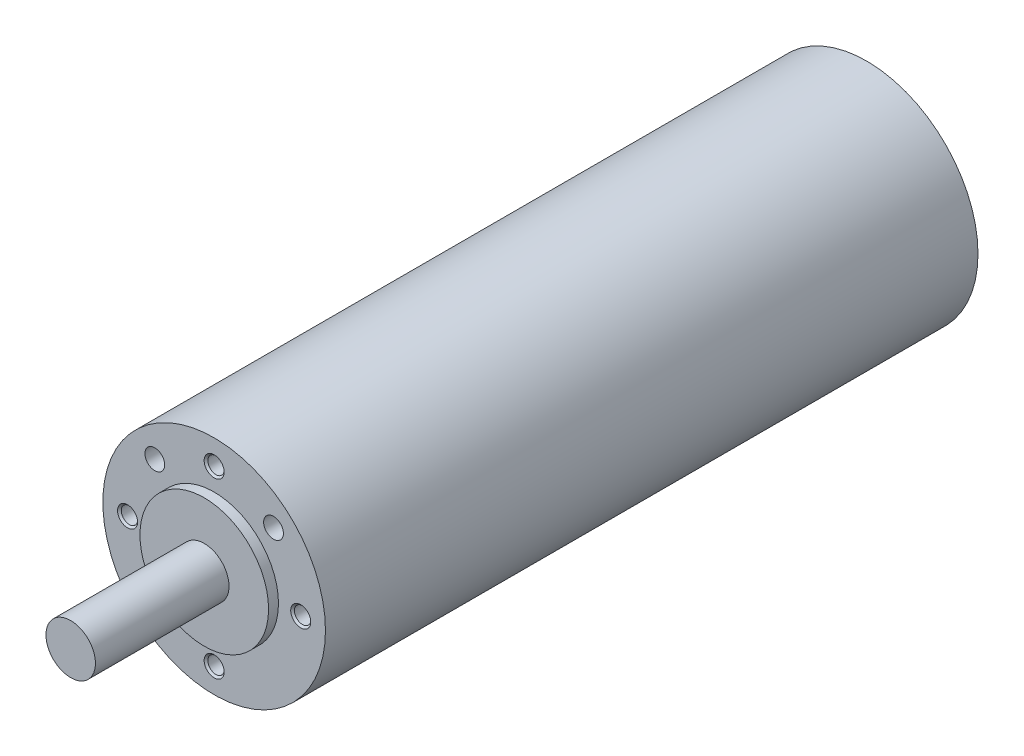
ISO-10303-21;
HEADER;
FILE_DESCRIPTION(('STEP AP214'),'2;1');
FILE_NAME('part.step','',(''),(''),'','','');
FILE_SCHEMA(('AUTOMOTIVE_DESIGN { 1 0 10303 214 1 1 1 1 }'));
ENDSEC;
DATA;
#1=APPLICATION_CONTEXT('core data for automotive mechanical design processes');
#2=APPLICATION_PROTOCOL_DEFINITION('international standard','automotive_design',2000,#1);
#3=PRODUCT_CONTEXT('',#1,'mechanical');
#4=PRODUCT('Part','Part','',(#3));
#5=PRODUCT_RELATED_PRODUCT_CATEGORY('part','',(#4));
#6=PRODUCT_DEFINITION_FORMATION('','',#4);
#7=PRODUCT_DEFINITION_CONTEXT('part definition',#1,'design');
#8=PRODUCT_DEFINITION('design','',#6,#7);
#9=PRODUCT_DEFINITION_SHAPE('','',#8);
#10=(LENGTH_UNIT() NAMED_UNIT(*) SI_UNIT(.MILLI.,.METRE.));
#11=(NAMED_UNIT(*) PLANE_ANGLE_UNIT() SI_UNIT($,.RADIAN.));
#12=(NAMED_UNIT(*) SI_UNIT($,.STERADIAN.) SOLID_ANGLE_UNIT());
#13=UNCERTAINTY_MEASURE_WITH_UNIT(LENGTH_MEASURE(1.E-05),#10,'distance_accuracy_value','');
#14=(GEOMETRIC_REPRESENTATION_CONTEXT(3) GLOBAL_UNCERTAINTY_ASSIGNED_CONTEXT((#13)) GLOBAL_UNIT_ASSIGNED_CONTEXT((#10,
#11,#12)) REPRESENTATION_CONTEXT('',''));
#15=CARTESIAN_POINT('',(0.,0.,0.));
#16=DIRECTION('',(0.,0.,1.));
#17=DIRECTION('',(1.,0.,0.));
#18=AXIS2_PLACEMENT_3D('',#15,#16,#17);
#19=CARTESIAN_POINT('',(0.,0.,-131.9));
#20=DIRECTION('',(0.,0.,1.));
#21=DIRECTION('',(1.,0.,0.));
#22=AXIS2_PLACEMENT_3D('',#19,#20,#21);
#23=CYLINDRICAL_SURFACE('',#22,22.5);
#24=CARTESIAN_POINT('',(0.,0.,-131.9));
#25=DIRECTION('',(0.,0.,1.));
#26=DIRECTION('',(1.,0.,0.));
#27=AXIS2_PLACEMENT_3D('',#24,#25,#26);
#28=CIRCLE('',#27,22.5);
#29=CARTESIAN_POINT('',(22.5,0.,-131.9));
#30=VERTEX_POINT('',#29);
#31=EDGE_CURVE('E126',#30,#30,#28,.T.);
#32=ORIENTED_EDGE('',*,*,#31,.T.);
#33=EDGE_LOOP('',(#32));
#34=FACE_BOUND('',#33,.T.);
#35=CARTESIAN_POINT('',(0.,0.,0.));
#36=DIRECTION('',(0.,0.,1.));
#37=DIRECTION('',(1.,0.,0.));
#38=AXIS2_PLACEMENT_3D('',#35,#36,#37);
#39=CIRCLE('',#38,22.5);
#40=CARTESIAN_POINT('',(22.5,0.,0.));
#41=VERTEX_POINT('',#40);
#42=EDGE_CURVE('E56',#41,#41,#39,.T.);
#43=ORIENTED_EDGE('',*,*,#42,.F.);
#44=EDGE_LOOP('',(#43));
#45=FACE_BOUND('',#44,.T.);
#46=ADVANCED_FACE('F53',(#34,#45),#23,.T.);
#47=CARTESIAN_POINT('',(0.,0.,-131.9));
#48=DIRECTION('',(0.,0.,1.));
#49=DIRECTION('',(1.,0.,0.));
#50=AXIS2_PLACEMENT_3D('',#47,#48,#49);
#51=PLANE('',#50);
#52=ORIENTED_EDGE('',*,*,#31,.F.);
#53=EDGE_LOOP('',(#52));
#54=FACE_BOUND('',#53,.T.);
#55=ADVANCED_FACE('F136',(#54),#51,.F.);
#56=CARTESIAN_POINT('',(0.,0.,0.));
#57=DIRECTION('',(0.,0.,1.));
#58=DIRECTION('',(1.,0.,0.));
#59=AXIS2_PLACEMENT_3D('',#56,#57,#58);
#60=PLANE('',#59);
#61=CARTESIAN_POINT('',(-12.,12.737739202857,0.));
#62=DIRECTION('',(0.,0.,1.));
#63=DIRECTION('',(1.,0.,0.));
#64=AXIS2_PLACEMENT_3D('',#61,#62,#63);
#65=CIRCLE('',#64,2.);
#66=CARTESIAN_POINT('',(-10.,12.737739202857,0.));
#67=VERTEX_POINT('',#66);
#68=EDGE_CURVE('E222',#67,#67,#65,.T.);
#69=ORIENTED_EDGE('',*,*,#68,.F.);
#70=EDGE_LOOP('',(#69));
#71=FACE_BOUND('',#70,.T.);
#72=CARTESIAN_POINT('',(12.,12.737739202857,0.));
#73=DIRECTION('',(0.,0.,1.));
#74=DIRECTION('',(1.,0.,0.));
#75=AXIS2_PLACEMENT_3D('',#72,#73,#74);
#76=CIRCLE('',#75,2.);
#77=CARTESIAN_POINT('',(14.,12.737739202857,0.));
#78=VERTEX_POINT('',#77);
#79=EDGE_CURVE('E226',#78,#78,#76,.T.);
#80=ORIENTED_EDGE('',*,*,#79,.F.);
#81=EDGE_LOOP('',(#80));
#82=FACE_BOUND('',#81,.T.);
#83=CARTESIAN_POINT('',(0.,17.5,0.));
#84=DIRECTION('',(0.,0.,1.));
#85=DIRECTION('',(1.,0.,0.));
#86=AXIS2_PLACEMENT_3D('',#83,#84,#85);
#87=CIRCLE('',#86,2.025);
#88=CARTESIAN_POINT('',(2.025,17.5,0.));
#89=VERTEX_POINT('',#88);
#90=EDGE_CURVE('E92',#89,#89,#87,.T.);
#91=ORIENTED_EDGE('',*,*,#90,.F.);
#92=EDGE_LOOP('',(#91));
#93=FACE_BOUND('',#92,.T.);
#94=CARTESIAN_POINT('',(-17.5,0.,0.));
#95=DIRECTION('',(0.,0.,1.));
#96=DIRECTION('',(1.,0.,0.));
#97=AXIS2_PLACEMENT_3D('',#94,#95,#96);
#98=CIRCLE('',#97,2.025);
#99=CARTESIAN_POINT('',(-15.475,0.,0.));
#100=VERTEX_POINT('',#99);
#101=EDGE_CURVE('E85',#100,#100,#98,.T.);
#102=ORIENTED_EDGE('',*,*,#101,.F.);
#103=EDGE_LOOP('',(#102));
#104=FACE_BOUND('',#103,.T.);
#105=CARTESIAN_POINT('',(0.,-17.5,0.));
#106=DIRECTION('',(0.,0.,1.));
#107=DIRECTION('',(1.,0.,0.));
#108=AXIS2_PLACEMENT_3D('',#105,#106,#107);
#109=CIRCLE('',#108,2.025);
#110=CARTESIAN_POINT('',(2.025,-17.5,0.));
#111=VERTEX_POINT('',#110);
#112=EDGE_CURVE('E101',#111,#111,#109,.T.);
#113=ORIENTED_EDGE('',*,*,#112,.F.);
#114=EDGE_LOOP('',(#113));
#115=FACE_BOUND('',#114,.T.);
#116=CARTESIAN_POINT('',(17.5,0.,0.));
#117=DIRECTION('',(0.,0.,1.));
#118=DIRECTION('',(1.,0.,0.));
#119=AXIS2_PLACEMENT_3D('',#116,#117,#118);
#120=CIRCLE('',#119,2.025);
#121=CARTESIAN_POINT('',(19.525,0.,0.));
#122=VERTEX_POINT('',#121);
#123=EDGE_CURVE('E110',#122,#122,#120,.T.);
#124=ORIENTED_EDGE('',*,*,#123,.F.);
#125=EDGE_LOOP('',(#124));
#126=FACE_BOUND('',#125,.T.);
#127=CARTESIAN_POINT('',(0.,0.,0.));
#128=DIRECTION('',(0.,0.,1.));
#129=DIRECTION('',(1.,0.,0.));
#130=AXIS2_PLACEMENT_3D('',#127,#128,#129);
#131=CIRCLE('',#130,13.);
#132=CARTESIAN_POINT('',(13.,0.,0.));
#133=VERTEX_POINT('',#132);
#134=EDGE_CURVE('E61',#133,#133,#131,.T.);
#135=ORIENTED_EDGE('',*,*,#134,.F.);
#136=EDGE_LOOP('',(#135));
#137=FACE_BOUND('',#136,.T.);
#138=ORIENTED_EDGE('',*,*,#42,.T.);
#139=EDGE_LOOP('',(#138));
#140=FACE_BOUND('',#139,.T.);
#141=ADVANCED_FACE('F133',(#71,#82,#93,#104,#115,#126,#137,#140),#60,.T.);
#142=CARTESIAN_POINT('',(0.,0.,2.));
#143=DIRECTION('',(0.,0.,-1.));
#144=DIRECTION('',(-1.,0.,0.));
#145=AXIS2_PLACEMENT_3D('',#142,#143,#144);
#146=CYLINDRICAL_SURFACE('',#145,13.);
#147=CARTESIAN_POINT('',(0.,0.,2.));
#148=DIRECTION('',(0.,0.,1.));
#149=DIRECTION('',(1.,0.,0.));
#150=AXIS2_PLACEMENT_3D('',#147,#148,#149);
#151=CIRCLE('',#150,13.);
#152=CARTESIAN_POINT('',(13.,0.,2.));
#153=VERTEX_POINT('',#152);
#154=EDGE_CURVE('E121',#153,#153,#151,.T.);
#155=ORIENTED_EDGE('',*,*,#154,.F.);
#156=EDGE_LOOP('',(#155));
#157=FACE_BOUND('',#156,.T.);
#158=ORIENTED_EDGE('',*,*,#134,.T.);
#159=EDGE_LOOP('',(#158));
#160=FACE_BOUND('',#159,.T.);
#161=ADVANCED_FACE('F146',(#157,#160),#146,.T.);
#162=CARTESIAN_POINT('',(0.,0.,2.));
#163=DIRECTION('',(0.,0.,1.));
#164=DIRECTION('',(1.,0.,0.));
#165=AXIS2_PLACEMENT_3D('',#162,#163,#164);
#166=PLANE('',#165);
#167=CARTESIAN_POINT('',(0.,0.,2.));
#168=DIRECTION('',(0.,0.,1.));
#169=DIRECTION('',(1.,0.,0.));
#170=AXIS2_PLACEMENT_3D('',#167,#168,#169);
#171=CIRCLE('',#170,5.);
#172=CARTESIAN_POINT('',(5.,0.,2.));
#173=VERTEX_POINT('',#172);
#174=EDGE_CURVE('E11',#173,#173,#171,.T.);
#175=ORIENTED_EDGE('',*,*,#174,.F.);
#176=EDGE_LOOP('',(#175));
#177=FACE_BOUND('',#176,.T.);
#178=ORIENTED_EDGE('',*,*,#154,.T.);
#179=EDGE_LOOP('',(#178));
#180=FACE_BOUND('',#179,.T.);
#181=ADVANCED_FACE('F150',(#177,#180),#166,.T.);
#182=CARTESIAN_POINT('',(0.,0.,29.));
#183=DIRECTION('',(0.,0.,-1.));
#184=DIRECTION('',(-1.,0.,0.));
#185=AXIS2_PLACEMENT_3D('',#182,#183,#184);
#186=CYLINDRICAL_SURFACE('',#185,5.);
#187=CARTESIAN_POINT('',(0.,0.,29.));
#188=DIRECTION('',(0.,0.,1.));
#189=DIRECTION('',(1.,0.,0.));
#190=AXIS2_PLACEMENT_3D('',#187,#188,#189);
#191=CIRCLE('',#190,5.);
#192=CARTESIAN_POINT('',(5.,0.,29.));
#193=VERTEX_POINT('',#192);
#194=EDGE_CURVE('E119',#193,#193,#191,.T.);
#195=ORIENTED_EDGE('',*,*,#194,.F.);
#196=EDGE_LOOP('',(#195));
#197=FACE_BOUND('',#196,.T.);
#198=ORIENTED_EDGE('',*,*,#174,.T.);
#199=EDGE_LOOP('',(#198));
#200=FACE_BOUND('',#199,.T.);
#201=ADVANCED_FACE('F154',(#197,#200),#186,.T.);
#202=CARTESIAN_POINT('',(0.,0.,29.));
#203=DIRECTION('',(0.,0.,1.));
#204=DIRECTION('',(1.,0.,0.));
#205=AXIS2_PLACEMENT_3D('',#202,#203,#204);
#206=PLANE('',#205);
#207=ORIENTED_EDGE('',*,*,#194,.T.);
#208=EDGE_LOOP('',(#207));
#209=FACE_BOUND('',#208,.T.);
#210=ADVANCED_FACE('F158',(#209),#206,.T.);
#211=CARTESIAN_POINT('',(17.5,0.,-9.));
#212=DIRECTION('',(0.,0.,1.));
#213=DIRECTION('',(1.,0.,0.));
#214=AXIS2_PLACEMENT_3D('',#211,#212,#213);
#215=CONICAL_SURFACE('',#214,1.65,1.02974425867665);
#216=CARTESIAN_POINT('',(17.5,0.,-9.99142002139548));
#217=VERTEX_POINT('',#216);
#218=VERTEX_LOOP('',#217);
#219=FACE_BOUND('',#218,.T.);
#220=CARTESIAN_POINT('',(17.5,0.,-9.));
#221=DIRECTION('',(0.,0.,1.));
#222=DIRECTION('',(1.,0.,0.));
#223=AXIS2_PLACEMENT_3D('',#220,#221,#222);
#224=CIRCLE('',#223,1.65);
#225=CARTESIAN_POINT('',(19.15,0.,-9.));
#226=VERTEX_POINT('',#225);
#227=EDGE_CURVE('E116',#226,#226,#224,.T.);
#228=ORIENTED_EDGE('',*,*,#227,.T.);
#229=EDGE_LOOP('',(#228));
#230=FACE_BOUND('',#229,.T.);
#231=ADVANCED_FACE('F162',(#219,#230),#215,.F.);
#232=CARTESIAN_POINT('',(17.5,0.,0.));
#233=DIRECTION('',(0.,0.,1.));
#234=DIRECTION('',(1.,0.,0.));
#235=AXIS2_PLACEMENT_3D('',#232,#233,#234);
#236=CYLINDRICAL_SURFACE('',#235,1.65);
#237=ORIENTED_EDGE('',*,*,#227,.F.);
#238=EDGE_LOOP('',(#237));
#239=FACE_BOUND('',#238,.T.);
#240=CARTESIAN_POINT('',(17.5,0.,-0.375));
#241=DIRECTION('',(0.,0.,1.));
#242=DIRECTION('',(1.,0.,0.));
#243=AXIS2_PLACEMENT_3D('',#240,#241,#242);
#244=CIRCLE('',#243,1.65);
#245=CARTESIAN_POINT('',(19.15,0.,-0.375));
#246=VERTEX_POINT('',#245);
#247=EDGE_CURVE('E113',#246,#246,#244,.T.);
#248=ORIENTED_EDGE('',*,*,#247,.T.);
#249=EDGE_LOOP('',(#248));
#250=FACE_BOUND('',#249,.T.);
#251=ADVANCED_FACE('F166',(#239,#250),#236,.F.);
#252=CARTESIAN_POINT('',(17.5,0.,0.));
#253=DIRECTION('',(0.,0.,1.));
#254=DIRECTION('',(1.,0.,0.));
#255=AXIS2_PLACEMENT_3D('',#252,#253,#254);
#256=CONICAL_SURFACE('',#255,2.025,0.785398163397446);
#257=ORIENTED_EDGE('',*,*,#247,.F.);
#258=EDGE_LOOP('',(#257));
#259=FACE_BOUND('',#258,.T.);
#260=ORIENTED_EDGE('',*,*,#123,.T.);
#261=EDGE_LOOP('',(#260));
#262=FACE_BOUND('',#261,.T.);
#263=ADVANCED_FACE('F169',(#259,#262),#256,.F.);
#264=CARTESIAN_POINT('',(0.,-17.5,-9.));
#265=DIRECTION('',(0.,0.,1.));
#266=DIRECTION('',(1.,0.,0.));
#267=AXIS2_PLACEMENT_3D('',#264,#265,#266);
#268=CONICAL_SURFACE('',#267,1.65,1.02974425867665);
#269=CARTESIAN_POINT('',(0.,-17.5,-9.99142002139548));
#270=VERTEX_POINT('',#269);
#271=VERTEX_LOOP('',#270);
#272=FACE_BOUND('',#271,.T.);
#273=CARTESIAN_POINT('',(0.,-17.5,-9.));
#274=DIRECTION('',(0.,0.,1.));
#275=DIRECTION('',(1.,0.,0.));
#276=AXIS2_PLACEMENT_3D('',#273,#274,#275);
#277=CIRCLE('',#276,1.65);
#278=CARTESIAN_POINT('',(1.65,-17.5,-9.));
#279=VERTEX_POINT('',#278);
#280=EDGE_CURVE('E107',#279,#279,#277,.T.);
#281=ORIENTED_EDGE('',*,*,#280,.T.);
#282=EDGE_LOOP('',(#281));
#283=FACE_BOUND('',#282,.T.);
#284=ADVANCED_FACE('F173',(#272,#283),#268,.F.);
#285=CARTESIAN_POINT('',(0.,-17.5,0.));
#286=DIRECTION('',(0.,0.,1.));
#287=DIRECTION('',(1.,0.,0.));
#288=AXIS2_PLACEMENT_3D('',#285,#286,#287);
#289=CYLINDRICAL_SURFACE('',#288,1.65);
#290=ORIENTED_EDGE('',*,*,#280,.F.);
#291=EDGE_LOOP('',(#290));
#292=FACE_BOUND('',#291,.T.);
#293=CARTESIAN_POINT('',(0.,-17.5,-0.375));
#294=DIRECTION('',(0.,0.,1.));
#295=DIRECTION('',(1.,0.,0.));
#296=AXIS2_PLACEMENT_3D('',#293,#294,#295);
#297=CIRCLE('',#296,1.65);
#298=CARTESIAN_POINT('',(1.65,-17.5,-0.375));
#299=VERTEX_POINT('',#298);
#300=EDGE_CURVE('E104',#299,#299,#297,.T.);
#301=ORIENTED_EDGE('',*,*,#300,.T.);
#302=EDGE_LOOP('',(#301));
#303=FACE_BOUND('',#302,.T.);
#304=ADVANCED_FACE('F177',(#292,#303),#289,.F.);
#305=CARTESIAN_POINT('',(0.,-17.5,0.));
#306=DIRECTION('',(0.,0.,1.));
#307=DIRECTION('',(1.,0.,0.));
#308=AXIS2_PLACEMENT_3D('',#305,#306,#307);
#309=CONICAL_SURFACE('',#308,2.025,0.785398163397446);
#310=ORIENTED_EDGE('',*,*,#300,.F.);
#311=EDGE_LOOP('',(#310));
#312=FACE_BOUND('',#311,.T.);
#313=ORIENTED_EDGE('',*,*,#112,.T.);
#314=EDGE_LOOP('',(#313));
#315=FACE_BOUND('',#314,.T.);
#316=ADVANCED_FACE('F180',(#312,#315),#309,.F.);
#317=CARTESIAN_POINT('',(-17.5,0.,-9.));
#318=DIRECTION('',(0.,0.,1.));
#319=DIRECTION('',(1.,0.,0.));
#320=AXIS2_PLACEMENT_3D('',#317,#318,#319);
#321=CONICAL_SURFACE('',#320,1.65,1.02974425867665);
#322=CARTESIAN_POINT('',(-17.5,0.,-9.99142002139548));
#323=VERTEX_POINT('',#322);
#324=VERTEX_LOOP('',#323);
#325=FACE_BOUND('',#324,.T.);
#326=CARTESIAN_POINT('',(-17.5,0.,-9.));
#327=DIRECTION('',(0.,0.,1.));
#328=DIRECTION('',(1.,0.,0.));
#329=AXIS2_PLACEMENT_3D('',#326,#327,#328);
#330=CIRCLE('',#329,1.65);
#331=CARTESIAN_POINT('',(-15.85,0.,-9.));
#332=VERTEX_POINT('',#331);
#333=EDGE_CURVE('E98',#332,#332,#330,.T.);
#334=ORIENTED_EDGE('',*,*,#333,.T.);
#335=EDGE_LOOP('',(#334));
#336=FACE_BOUND('',#335,.T.);
#337=ADVANCED_FACE('F184',(#325,#336),#321,.F.);
#338=CARTESIAN_POINT('',(-17.5,0.,0.));
#339=DIRECTION('',(0.,0.,1.));
#340=DIRECTION('',(1.,0.,0.));
#341=AXIS2_PLACEMENT_3D('',#338,#339,#340);
#342=CYLINDRICAL_SURFACE('',#341,1.65);
#343=ORIENTED_EDGE('',*,*,#333,.F.);
#344=EDGE_LOOP('',(#343));
#345=FACE_BOUND('',#344,.T.);
#346=CARTESIAN_POINT('',(-17.5,0.,-0.375));
#347=DIRECTION('',(0.,0.,1.));
#348=DIRECTION('',(1.,0.,0.));
#349=AXIS2_PLACEMENT_3D('',#346,#347,#348);
#350=CIRCLE('',#349,1.65);
#351=CARTESIAN_POINT('',(-15.85,0.,-0.375));
#352=VERTEX_POINT('',#351);
#353=EDGE_CURVE('E89',#352,#352,#350,.T.);
#354=ORIENTED_EDGE('',*,*,#353,.T.);
#355=EDGE_LOOP('',(#354));
#356=FACE_BOUND('',#355,.T.);
#357=ADVANCED_FACE('F188',(#345,#356),#342,.F.);
#358=CARTESIAN_POINT('',(-17.5,0.,0.));
#359=DIRECTION('',(0.,0.,1.));
#360=DIRECTION('',(1.,0.,0.));
#361=AXIS2_PLACEMENT_3D('',#358,#359,#360);
#362=CONICAL_SURFACE('',#361,2.025,0.785398163397446);
#363=ORIENTED_EDGE('',*,*,#353,.F.);
#364=EDGE_LOOP('',(#363));
#365=FACE_BOUND('',#364,.T.);
#366=ORIENTED_EDGE('',*,*,#101,.T.);
#367=EDGE_LOOP('',(#366));
#368=FACE_BOUND('',#367,.T.);
#369=ADVANCED_FACE('F79',(#365,#368),#362,.F.);
#370=CARTESIAN_POINT('',(0.,17.5,-9.));
#371=DIRECTION('',(0.,0.,1.));
#372=DIRECTION('',(1.,0.,0.));
#373=AXIS2_PLACEMENT_3D('',#370,#371,#372);
#374=CONICAL_SURFACE('',#373,1.65,1.02974425867665);
#375=CARTESIAN_POINT('',(0.,17.5,-9.99142002139548));
#376=VERTEX_POINT('',#375);
#377=VERTEX_LOOP('',#376);
#378=FACE_BOUND('',#377,.T.);
#379=CARTESIAN_POINT('',(0.,17.5,-9.));
#380=DIRECTION('',(0.,0.,1.));
#381=DIRECTION('',(1.,0.,0.));
#382=AXIS2_PLACEMENT_3D('',#379,#380,#381);
#383=CIRCLE('',#382,1.65);
#384=CARTESIAN_POINT('',(1.65,17.5,-9.));
#385=VERTEX_POINT('',#384);
#386=EDGE_CURVE('E83',#385,#385,#383,.T.);
#387=ORIENTED_EDGE('',*,*,#386,.T.);
#388=EDGE_LOOP('',(#387));
#389=FACE_BOUND('',#388,.T.);
#390=ADVANCED_FACE('F75',(#378,#389),#374,.F.);
#391=CARTESIAN_POINT('',(0.,17.5,0.));
#392=DIRECTION('',(0.,0.,1.));
#393=DIRECTION('',(1.,0.,0.));
#394=AXIS2_PLACEMENT_3D('',#391,#392,#393);
#395=CYLINDRICAL_SURFACE('',#394,1.65);
#396=ORIENTED_EDGE('',*,*,#386,.F.);
#397=EDGE_LOOP('',(#396));
#398=FACE_BOUND('',#397,.T.);
#399=CARTESIAN_POINT('',(0.,17.5,-0.375));
#400=DIRECTION('',(0.,0.,1.));
#401=DIRECTION('',(1.,0.,0.));
#402=AXIS2_PLACEMENT_3D('',#399,#400,#401);
#403=CIRCLE('',#402,1.65);
#404=CARTESIAN_POINT('',(1.65,17.5,-0.375));
#405=VERTEX_POINT('',#404);
#406=EDGE_CURVE('E86',#405,#405,#403,.T.);
#407=ORIENTED_EDGE('',*,*,#406,.T.);
#408=EDGE_LOOP('',(#407));
#409=FACE_BOUND('',#408,.T.);
#410=ADVANCED_FACE('F78',(#398,#409),#395,.F.);
#411=CARTESIAN_POINT('',(0.,17.5,0.));
#412=DIRECTION('',(0.,0.,1.));
#413=DIRECTION('',(1.,0.,0.));
#414=AXIS2_PLACEMENT_3D('',#411,#412,#413);
#415=CONICAL_SURFACE('',#414,2.025,0.785398163397446);
#416=ORIENTED_EDGE('',*,*,#406,.F.);
#417=EDGE_LOOP('',(#416));
#418=FACE_BOUND('',#417,.T.);
#419=ORIENTED_EDGE('',*,*,#90,.T.);
#420=EDGE_LOOP('',(#419));
#421=FACE_BOUND('',#420,.T.);
#422=ADVANCED_FACE('F198',(#418,#421),#415,.F.);
#423=CARTESIAN_POINT('',(12.,12.737739202857,-25.));
#424=DIRECTION('',(0.,0.,1.));
#425=DIRECTION('',(1.,0.,0.));
#426=AXIS2_PLACEMENT_3D('',#423,#424,#425);
#427=CYLINDRICAL_SURFACE('',#426,2.);
#428=CARTESIAN_POINT('',(12.,12.737739202857,-25.));
#429=DIRECTION('',(0.,0.,1.));
#430=DIRECTION('',(1.,0.,0.));
#431=AXIS2_PLACEMENT_3D('',#428,#429,#430);
#432=CIRCLE('',#431,2.);
#433=CARTESIAN_POINT('',(14.,12.737739202857,-25.));
#434=VERTEX_POINT('',#433);
#435=EDGE_CURVE('E231',#434,#434,#432,.T.);
#436=ORIENTED_EDGE('',*,*,#435,.F.);
#437=EDGE_LOOP('',(#436));
#438=FACE_BOUND('',#437,.T.);
#439=ORIENTED_EDGE('',*,*,#79,.T.);
#440=EDGE_LOOP('',(#439));
#441=FACE_BOUND('',#440,.T.);
#442=ADVANCED_FACE('F201',(#438,#441),#427,.F.);
#443=CARTESIAN_POINT('',(12.,12.737739202857,-25.));
#444=DIRECTION('',(0.,0.,1.));
#445=DIRECTION('',(1.,0.,0.));
#446=AXIS2_PLACEMENT_3D('',#443,#444,#445);
#447=PLANE('',#446);
#448=ORIENTED_EDGE('',*,*,#435,.T.);
#449=EDGE_LOOP('',(#448));
#450=FACE_BOUND('',#449,.T.);
#451=ADVANCED_FACE('F203',(#450),#447,.T.);
#452=CARTESIAN_POINT('',(-12.,12.737739202857,-25.));
#453=DIRECTION('',(0.,0.,1.));
#454=DIRECTION('',(1.,0.,0.));
#455=AXIS2_PLACEMENT_3D('',#452,#453,#454);
#456=CYLINDRICAL_SURFACE('',#455,2.);
#457=CARTESIAN_POINT('',(-12.,12.737739202857,-25.));
#458=DIRECTION('',(0.,0.,1.));
#459=DIRECTION('',(1.,0.,0.));
#460=AXIS2_PLACEMENT_3D('',#457,#458,#459);
#461=CIRCLE('',#460,2.);
#462=CARTESIAN_POINT('',(-10.,12.737739202857,-25.));
#463=VERTEX_POINT('',#462);
#464=EDGE_CURVE('E221',#463,#463,#461,.T.);
#465=ORIENTED_EDGE('',*,*,#464,.F.);
#466=EDGE_LOOP('',(#465));
#467=FACE_BOUND('',#466,.T.);
#468=ORIENTED_EDGE('',*,*,#68,.T.);
#469=EDGE_LOOP('',(#468));
#470=FACE_BOUND('',#469,.T.);
#471=ADVANCED_FACE('F206',(#467,#470),#456,.F.);
#472=CARTESIAN_POINT('',(-12.,12.737739202857,-25.));
#473=DIRECTION('',(0.,0.,1.));
#474=DIRECTION('',(1.,0.,0.));
#475=AXIS2_PLACEMENT_3D('',#472,#473,#474);
#476=PLANE('',#475);
#477=ORIENTED_EDGE('',*,*,#464,.T.);
#478=EDGE_LOOP('',(#477));
#479=FACE_BOUND('',#478,.T.);
#480=ADVANCED_FACE('F213',(#479),#476,.T.);
#481=CLOSED_SHELL('',(#46,#55,#141,#161,#181,#201,#210,#231,#251,#263,#284,#304,#316,#337,#357,
#369,#390,#410,#422,#442,#451,#471,#480));
#482=MANIFOLD_SOLID_BREP('B2',#481);
#483=ADVANCED_BREP_SHAPE_REPRESENTATION('',(#18,#482),#14);
#484=SHAPE_DEFINITION_REPRESENTATION(#9,#483);
ENDSEC;
END-ISO-10303-21;
